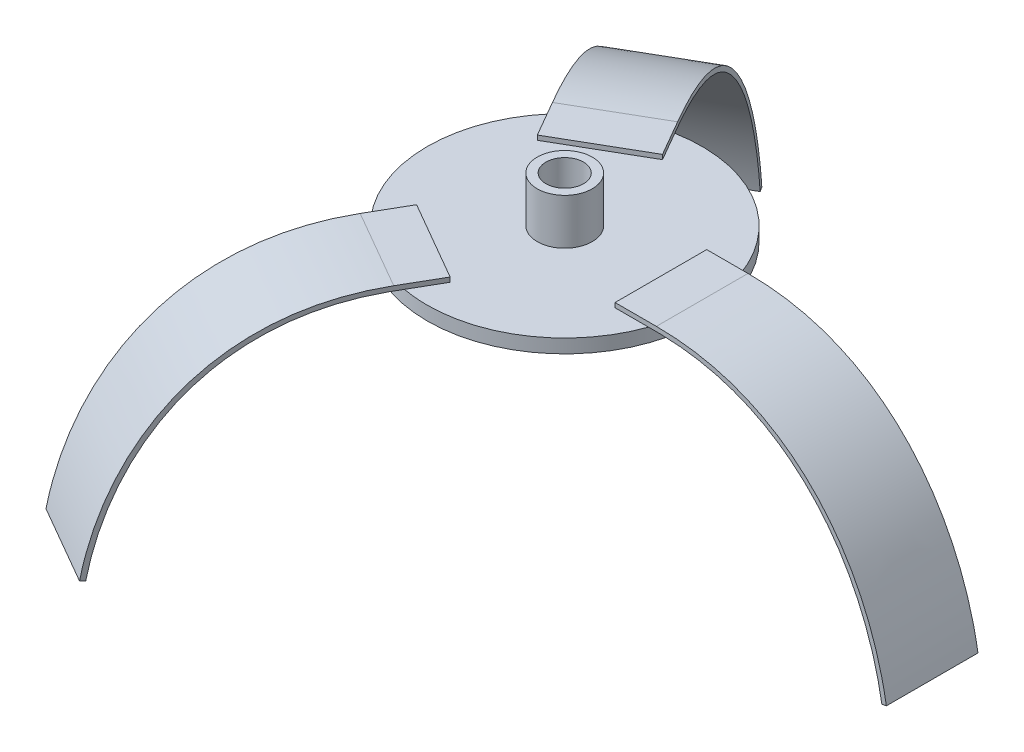
ISO-10303-21;
HEADER;
FILE_DESCRIPTION(('STEP AP214'),'2;1');
FILE_NAME('part.step','',(''),(''),'','','');
FILE_SCHEMA(('AUTOMOTIVE_DESIGN { 1 0 10303 214 1 1 1 1 }'));
ENDSEC;
DATA;
#1=APPLICATION_CONTEXT('core data for automotive mechanical design processes');
#2=APPLICATION_PROTOCOL_DEFINITION('international standard','automotive_design',2000,#1);
#3=PRODUCT_CONTEXT('',#1,'mechanical');
#4=PRODUCT('Part','Part','',(#3));
#5=PRODUCT_RELATED_PRODUCT_CATEGORY('part','',(#4));
#6=PRODUCT_DEFINITION_FORMATION('','',#4);
#7=PRODUCT_DEFINITION_CONTEXT('part definition',#1,'design');
#8=PRODUCT_DEFINITION('design','',#6,#7);
#9=PRODUCT_DEFINITION_SHAPE('','',#8);
#10=(LENGTH_UNIT() NAMED_UNIT(*) SI_UNIT(.MILLI.,.METRE.));
#11=(NAMED_UNIT(*) PLANE_ANGLE_UNIT() SI_UNIT($,.RADIAN.));
#12=(NAMED_UNIT(*) SI_UNIT($,.STERADIAN.) SOLID_ANGLE_UNIT());
#13=UNCERTAINTY_MEASURE_WITH_UNIT(LENGTH_MEASURE(1.E-05),#10,'distance_accuracy_value','');
#14=(GEOMETRIC_REPRESENTATION_CONTEXT(3) GLOBAL_UNCERTAINTY_ASSIGNED_CONTEXT((#13)) GLOBAL_UNIT_ASSIGNED_CONTEXT((#10,
#11,#12)) REPRESENTATION_CONTEXT('',''));
#15=CARTESIAN_POINT('',(0.,0.,0.));
#16=DIRECTION('',(0.,0.,1.));
#17=DIRECTION('',(1.,0.,0.));
#18=AXIS2_PLACEMENT_3D('',#15,#16,#17);
#19=CARTESIAN_POINT('',(0.,-3.,0.));
#20=DIRECTION('',(0.,1.,0.));
#21=DIRECTION('',(0.,0.,1.));
#22=AXIS2_PLACEMENT_3D('',#19,#20,#21);
#23=CYLINDRICAL_SURFACE('',#22,30.);
#24=CARTESIAN_POINT('',(0.,-3.,0.));
#25=DIRECTION('',(0.,1.,0.));
#26=DIRECTION('',(0.,0.,1.));
#27=AXIS2_PLACEMENT_3D('',#24,#25,#26);
#28=CIRCLE('',#27,30.);
#29=CARTESIAN_POINT('',(0.,-3.,30.));
#30=VERTEX_POINT('',#29);
#31=EDGE_CURVE('E417',#30,#30,#28,.T.);
#32=ORIENTED_EDGE('',*,*,#31,.T.);
#33=EDGE_LOOP('',(#32));
#34=FACE_BOUND('',#33,.T.);
#35=CARTESIAN_POINT('',(0.,0.,0.));
#36=DIRECTION('',(0.,1.,0.));
#37=DIRECTION('',(0.,0.,1.));
#38=AXIS2_PLACEMENT_3D('',#35,#36,#37);
#39=CIRCLE('',#38,30.);
#40=CARTESIAN_POINT('',(-22.8023896615752,0.,-19.494897427832));
#41=VERTEX_POINT('',#40);
#42=CARTESIAN_POINT('',(-22.8023896615754,0.,19.4948974278317));
#43=VERTEX_POINT('',#42);
#44=EDGE_CURVE('E438',#41,#43,#39,.T.);
#45=ORIENTED_EDGE('',*,*,#44,.F.);
#46=DIRECTION('',(0.,1.,0.));
#47=VECTOR('',#46,1.);
#48=CARTESIAN_POINT('',(-22.8023896615752,-3.,-19.494897427832));
#49=LINE('',#48,#47);
#50=CARTESIAN_POINT('',(-22.8023896615752,-0.00629805614795278,-19.494897427832));
#51=VERTEX_POINT('',#50);
#52=EDGE_CURVE('E48',#41,#51,#49,.F.);
#53=ORIENTED_EDGE('',*,*,#52,.T.);
#54=CARTESIAN_POINT('',(0.,0.0181105178194184,0.));
#55=DIRECTION('',(-0.000431486543616557,0.999999627638656,-0.000747356616326177));
#56=DIRECTION('',(0.49999981381932,0.000862973087233128,0.86602508131006));
#57=AXIS2_PLACEMENT_3D('',#54,#55,#56);
#58=ELLIPSE('',#57,30.0000111708445,30.);
#59=CARTESIAN_POINT('',(-5.48188158588629,-0.00629805614795273,-29.4948974278318));
#60=VERTEX_POINT('',#59);
#61=EDGE_CURVE('E52',#51,#60,#58,.F.);
#62=ORIENTED_EDGE('',*,*,#61,.T.);
#63=DIRECTION('',(0.,1.,0.));
#64=VECTOR('',#63,1.);
#65=CARTESIAN_POINT('',(-5.48188158588629,-3.,-29.4948974278318));
#66=LINE('',#65,#64);
#67=CARTESIAN_POINT('',(-5.48188158588629,0.,-29.4948974278318));
#68=VERTEX_POINT('',#67);
#69=EDGE_CURVE('E433',#68,#60,#66,.F.);
#70=ORIENTED_EDGE('',*,*,#69,.F.);
#71=CARTESIAN_POINT('',(28.2842712474619,0.,-10.));
#72=VERTEX_POINT('',#71);
#73=EDGE_CURVE('E423',#72,#68,#39,.T.);
#74=ORIENTED_EDGE('',*,*,#73,.F.);
#75=DIRECTION('',(0.,1.,0.));
#76=VECTOR('',#75,1.);
#77=CARTESIAN_POINT('',(28.2842712474619,-3.,-10.));
#78=LINE('',#77,#76);
#79=CARTESIAN_POINT('',(28.2842712474619,-0.00629805614795278,-10.));
#80=VERTEX_POINT('',#79);
#81=EDGE_CURVE('E537',#72,#80,#78,.F.);
#82=ORIENTED_EDGE('',*,*,#81,.T.);
#83=CARTESIAN_POINT('',(0.,0.0181105178194184,0.));
#84=DIRECTION('',(0.000862973087233128,0.999999627638656,0.));
#85=DIRECTION('',(-0.999999627638656,0.000862973087233128,0.));
#86=AXIS2_PLACEMENT_3D('',#83,#84,#85);
#87=ELLIPSE('',#86,30.0000111708445,30.);
#88=CARTESIAN_POINT('',(28.2842712474619,-0.00629805614795273,10.));
#89=VERTEX_POINT('',#88);
#90=EDGE_CURVE('E539',#80,#89,#87,.F.);
#91=ORIENTED_EDGE('',*,*,#90,.T.);
#92=DIRECTION('',(0.,1.,0.));
#93=VECTOR('',#92,1.);
#94=CARTESIAN_POINT('',(28.2842712474619,-3.,10.));
#95=LINE('',#94,#93);
#96=CARTESIAN_POINT('',(28.2842712474619,0.,10.));
#97=VERTEX_POINT('',#96);
#98=EDGE_CURVE('E534',#97,#89,#95,.F.);
#99=ORIENTED_EDGE('',*,*,#98,.F.);
#100=CARTESIAN_POINT('',(-5.4818815858867,0.,29.4948974278318));
#101=VERTEX_POINT('',#100);
#102=EDGE_CURVE('E439',#101,#97,#39,.T.);
#103=ORIENTED_EDGE('',*,*,#102,.F.);
#104=DIRECTION('',(0.,1.,0.));
#105=VECTOR('',#104,1.);
#106=CARTESIAN_POINT('',(-5.4818815858867,-3.,29.4948974278318));
#107=LINE('',#106,#105);
#108=CARTESIAN_POINT('',(-5.48188158588669,-0.00629805614795277,29.4948974278318));
#109=VERTEX_POINT('',#108);
#110=EDGE_CURVE('E314',#101,#109,#107,.F.);
#111=ORIENTED_EDGE('',*,*,#110,.T.);
#112=CARTESIAN_POINT('',(0.,0.018110517819418,0.));
#113=DIRECTION('',(-0.000431486543616567,0.999999627638656,0.000747356616326171));
#114=DIRECTION('',(0.499999813819332,0.000862973087233128,-0.866025081310053));
#115=AXIS2_PLACEMENT_3D('',#112,#113,#114);
#116=ELLIPSE('',#115,30.0000111708445,30.);
#117=CARTESIAN_POINT('',(-22.8023896615754,-0.00629805614795273,19.4948974278317));
#118=VERTEX_POINT('',#117);
#119=EDGE_CURVE('E316',#109,#118,#116,.F.);
#120=ORIENTED_EDGE('',*,*,#119,.T.);
#121=DIRECTION('',(0.,1.,0.));
#122=VECTOR('',#121,1.);
#123=CARTESIAN_POINT('',(-22.8023896615754,-3.,19.4948974278317));
#124=LINE('',#123,#122);
#125=EDGE_CURVE('E311',#43,#118,#124,.F.);
#126=ORIENTED_EDGE('',*,*,#125,.F.);
#127=EDGE_LOOP('',(#45,#53,#62,#70,#74,#82,#91,#99,#103,#111,#120,#126));
#128=FACE_BOUND('',#127,.T.);
#129=ADVANCED_FACE('F34',(#34,#128),#23,.T.);
#130=CARTESIAN_POINT('',(0.,0.,0.));
#131=DIRECTION('',(0.,1.,0.));
#132=DIRECTION('',(0.,0.,1.));
#133=AXIS2_PLACEMENT_3D('',#130,#131,#132);
#134=PLANE('',#133);
#135=CARTESIAN_POINT('',(0.,0.,0.));
#136=DIRECTION('',(0.,1.,0.));
#137=DIRECTION('',(0.,0.,1.));
#138=AXIS2_PLACEMENT_3D('',#135,#136,#137);
#139=CIRCLE('',#138,6.);
#140=CARTESIAN_POINT('',(0.,0.,6.));
#141=VERTEX_POINT('',#140);
#142=EDGE_CURVE('E541',#141,#141,#139,.T.);
#143=ORIENTED_EDGE('',*,*,#142,.F.);
#144=EDGE_LOOP('',(#143));
#145=FACE_BOUND('',#144,.T.);
#146=DIRECTION('',(0.866025403784443,0.,-0.499999999999992));
#147=VECTOR('',#146,1.);
#148=CARTESIAN_POINT('',(-19.1533455048258,0.,-13.1745675492796));
#149=LINE('',#148,#147);
#150=CARTESIAN_POINT('',(-19.1533455048258,0.,-13.1745675492796));
#151=VERTEX_POINT('',#150);
#152=CARTESIAN_POINT('',(-1.83283742913692,0.,-23.1745675492794));
#153=VERTEX_POINT('',#152);
#154=EDGE_CURVE('E203',#151,#153,#149,.T.);
#155=ORIENTED_EDGE('',*,*,#154,.F.);
#156=DIRECTION('',(-0.499999999999992,0.,-0.866025403784443));
#157=VECTOR('',#156,1.);
#158=CARTESIAN_POINT('',(-8.66025403784444,0.,4.99999999999992));
#159=LINE('',#158,#157);
#160=EDGE_CURVE('E11',#151,#41,#159,.T.);
#161=ORIENTED_EDGE('',*,*,#160,.T.);
#162=ORIENTED_EDGE('',*,*,#44,.T.);
#163=DIRECTION('',(-0.500000000000004,0.,0.866025403784436));
#164=VECTOR('',#163,1.);
#165=CARTESIAN_POINT('',(-8.66025403784436,0.,-5.00000000000004));
#166=LINE('',#165,#164);
#167=CARTESIAN_POINT('',(-19.153345504826,0.,13.1745675492794));
#168=VERTEX_POINT('',#167);
#169=EDGE_CURVE('E428',#168,#43,#166,.T.);
#170=ORIENTED_EDGE('',*,*,#169,.F.);
#171=DIRECTION('',(-0.866025403784436,0.,-0.500000000000004));
#172=VECTOR('',#171,1.);
#173=CARTESIAN_POINT('',(-1.83283742913724,0.,23.1745675492794));
#174=LINE('',#173,#172);
#175=CARTESIAN_POINT('',(-1.83283742913724,0.,23.1745675492794));
#176=VERTEX_POINT('',#175);
#177=EDGE_CURVE('E308',#176,#168,#174,.T.);
#178=ORIENTED_EDGE('',*,*,#177,.F.);
#179=DIRECTION('',(-0.500000000000004,0.,0.866025403784436));
#180=VECTOR('',#179,1.);
#181=CARTESIAN_POINT('',(8.66025403784436,0.,5.00000000000004));
#182=LINE('',#181,#180);
#183=EDGE_CURVE('E431',#176,#101,#182,.T.);
#184=ORIENTED_EDGE('',*,*,#183,.T.);
#185=ORIENTED_EDGE('',*,*,#102,.T.);
#186=DIRECTION('',(1.,0.,0.));
#187=VECTOR('',#186,1.);
#188=CARTESIAN_POINT('',(0.,0.,10.));
#189=LINE('',#188,#187);
#190=CARTESIAN_POINT('',(20.986182933963,0.,10.));
#191=VERTEX_POINT('',#190);
#192=EDGE_CURVE('E416',#191,#97,#189,.T.);
#193=ORIENTED_EDGE('',*,*,#192,.F.);
#194=DIRECTION('',(0.,0.,1.));
#195=VECTOR('',#194,1.);
#196=CARTESIAN_POINT('',(20.986182933963,0.,-10.));
#197=LINE('',#196,#195);
#198=CARTESIAN_POINT('',(20.986182933963,0.,-10.));
#199=VERTEX_POINT('',#198);
#200=EDGE_CURVE('E531',#199,#191,#197,.T.);
#201=ORIENTED_EDGE('',*,*,#200,.F.);
#202=DIRECTION('',(1.,0.,0.));
#203=VECTOR('',#202,1.);
#204=CARTESIAN_POINT('',(0.,0.,-10.));
#205=LINE('',#204,#203);
#206=EDGE_CURVE('E420',#199,#72,#205,.T.);
#207=ORIENTED_EDGE('',*,*,#206,.T.);
#208=ORIENTED_EDGE('',*,*,#73,.T.);
#209=DIRECTION('',(-0.499999999999992,0.,-0.866025403784443));
#210=VECTOR('',#209,1.);
#211=CARTESIAN_POINT('',(8.66025403784443,0.,-4.99999999999992));
#212=LINE('',#211,#210);
#213=EDGE_CURVE('E41',#153,#68,#212,.T.);
#214=ORIENTED_EDGE('',*,*,#213,.F.);
#215=EDGE_LOOP('',(#155,#161,#162,#170,#178,#184,#185,#193,#201,#207,#208,#214));
#216=FACE_BOUND('',#215,.T.);
#217=ADVANCED_FACE('F398',(#145,#216),#134,.T.);
#218=CARTESIAN_POINT('',(0.,-3.,0.));
#219=DIRECTION('',(0.,1.,0.));
#220=DIRECTION('',(0.,0.,1.));
#221=AXIS2_PLACEMENT_3D('',#218,#219,#220);
#222=PLANE('',#221);
#223=ORIENTED_EDGE('',*,*,#31,.F.);
#224=EDGE_LOOP('',(#223));
#225=FACE_BOUND('',#224,.T.);
#226=ADVANCED_FACE('F395',(#225),#222,.F.);
#227=CARTESIAN_POINT('',(0.,10.,0.));
#228=DIRECTION('',(0.,-1.,0.));
#229=DIRECTION('',(0.,0.,-1.));
#230=AXIS2_PLACEMENT_3D('',#227,#228,#229);
#231=CYLINDRICAL_SURFACE('',#230,4.1);
#232=CARTESIAN_POINT('',(0.,10.,0.));
#233=DIRECTION('',(0.,1.,0.));
#234=DIRECTION('',(0.,0.,1.));
#235=AXIS2_PLACEMENT_3D('',#232,#233,#234);
#236=CIRCLE('',#235,4.1);
#237=CARTESIAN_POINT('',(0.,10.,4.1));
#238=VERTEX_POINT('',#237);
#239=EDGE_CURVE('E542',#238,#238,#236,.T.);
#240=ORIENTED_EDGE('',*,*,#239,.T.);
#241=EDGE_LOOP('',(#240));
#242=FACE_BOUND('',#241,.T.);
#243=CARTESIAN_POINT('',(0.,0.,0.));
#244=DIRECTION('',(0.,1.,0.));
#245=DIRECTION('',(0.,0.,1.));
#246=AXIS2_PLACEMENT_3D('',#243,#244,#245);
#247=CIRCLE('',#246,4.1);
#248=CARTESIAN_POINT('',(0.,0.,4.1));
#249=VERTEX_POINT('',#248);
#250=EDGE_CURVE('E414',#249,#249,#247,.F.);
#251=ORIENTED_EDGE('',*,*,#250,.T.);
#252=EDGE_LOOP('',(#251));
#253=FACE_BOUND('',#252,.T.);
#254=ADVANCED_FACE('F391',(#242,#253),#231,.F.);
#255=CARTESIAN_POINT('',(0.,10.,0.));
#256=DIRECTION('',(0.,-1.,0.));
#257=DIRECTION('',(0.,0.,-1.));
#258=AXIS2_PLACEMENT_3D('',#255,#256,#257);
#259=CYLINDRICAL_SURFACE('',#258,6.);
#260=CARTESIAN_POINT('',(0.,10.,0.));
#261=DIRECTION('',(0.,1.,0.));
#262=DIRECTION('',(0.,0.,1.));
#263=AXIS2_PLACEMENT_3D('',#260,#261,#262);
#264=CIRCLE('',#263,6.);
#265=CARTESIAN_POINT('',(0.,10.,6.));
#266=VERTEX_POINT('',#265);
#267=EDGE_CURVE('E545',#266,#266,#264,.T.);
#268=ORIENTED_EDGE('',*,*,#267,.F.);
#269=EDGE_LOOP('',(#268));
#270=FACE_BOUND('',#269,.T.);
#271=ORIENTED_EDGE('',*,*,#142,.T.);
#272=EDGE_LOOP('',(#271));
#273=FACE_BOUND('',#272,.T.);
#274=ADVANCED_FACE('F387',(#270,#273),#259,.T.);
#275=CARTESIAN_POINT('',(0.,10.,0.));
#276=DIRECTION('',(0.,1.,0.));
#277=DIRECTION('',(0.,0.,1.));
#278=AXIS2_PLACEMENT_3D('',#275,#276,#277);
#279=PLANE('',#278);
#280=ORIENTED_EDGE('',*,*,#239,.F.);
#281=EDGE_LOOP('',(#280));
#282=FACE_BOUND('',#281,.T.);
#283=ORIENTED_EDGE('',*,*,#267,.T.);
#284=EDGE_LOOP('',(#283));
#285=FACE_BOUND('',#284,.T.);
#286=ADVANCED_FACE('F384',(#282,#285),#279,.T.);
#287=ORIENTED_EDGE('',*,*,#250,.F.);
#288=EDGE_LOOP('',(#287));
#289=FACE_BOUND('',#288,.T.);
#290=ADVANCED_FACE('F382',(#289),#134,.T.);
#291=CARTESIAN_POINT('',(30.9999626604561,-0.00864162562325154,-10.));
#292=DIRECTION('',(0.000862973087233128,0.999999627638656,0.));
#293=DIRECTION('',(-0.999999627638656,0.000862973087233128,0.));
#294=AXIS2_PLACEMENT_3D('',#291,#292,#293);
#295=PLANE('',#294);
#296=ORIENTED_EDGE('',*,*,#90,.F.);
#297=DIRECTION('',(-0.999999627638656,0.000862973087233128,0.));
#298=VECTOR('',#297,1.);
#299=CARTESIAN_POINT('',(30.9999626604561,-0.00864162562325154,-10.));
#300=LINE('',#299,#298);
#301=CARTESIAN_POINT('',(30.9999626604561,-0.00864162562325154,-10.));
#302=VERTEX_POINT('',#301);
#303=EDGE_CURVE('E343',#302,#80,#300,.T.);
#304=ORIENTED_EDGE('',*,*,#303,.F.);
#305=DIRECTION('',(0.,0.,1.));
#306=VECTOR('',#305,1.);
#307=CARTESIAN_POINT('',(30.9999626604561,-0.00864162562325154,-10.));
#308=LINE('',#307,#306);
#309=CARTESIAN_POINT('',(30.9999626604561,-0.00864162562325154,10.));
#310=VERTEX_POINT('',#309);
#311=EDGE_CURVE('E518',#302,#310,#308,.T.);
#312=ORIENTED_EDGE('',*,*,#311,.T.);
#313=DIRECTION('',(-0.999999627638656,0.000862973087233128,0.));
#314=VECTOR('',#313,1.);
#315=CARTESIAN_POINT('',(30.9999626604561,-0.00864162562325154,10.));
#316=LINE('',#315,#314);
#317=EDGE_CURVE('E318',#310,#89,#316,.T.);
#318=ORIENTED_EDGE('',*,*,#317,.T.);
#319=EDGE_LOOP('',(#296,#304,#312,#318));
#320=FACE_BOUND('',#319,.T.);
#321=ADVANCED_FACE('F378',(#320),#295,.F.);
#322=CARTESIAN_POINT('',(20.986182933963,0.,-10.));
#323=DIRECTION('',(1.,0.,0.));
#324=DIRECTION('',(0.,0.,-1.));
#325=AXIS2_PLACEMENT_3D('',#322,#323,#324);
#326=PLANE('',#325);
#327=ORIENTED_EDGE('',*,*,#200,.T.);
#328=DIRECTION('',(0.,1.,0.));
#329=VECTOR('',#328,1.);
#330=CARTESIAN_POINT('',(20.986182933963,0.,10.));
#331=LINE('',#330,#329);
#332=CARTESIAN_POINT('',(20.986182933963,1.,10.));
#333=VERTEX_POINT('',#332);
#334=EDGE_CURVE('E321',#191,#333,#331,.T.);
#335=ORIENTED_EDGE('',*,*,#334,.T.);
#336=DIRECTION('',(0.,0.,1.));
#337=VECTOR('',#336,1.);
#338=CARTESIAN_POINT('',(20.986182933963,1.,-10.));
#339=LINE('',#338,#337);
#340=CARTESIAN_POINT('',(20.986182933963,1.,-10.));
#341=VERTEX_POINT('',#340);
#342=EDGE_CURVE('E529',#341,#333,#339,.T.);
#343=ORIENTED_EDGE('',*,*,#342,.F.);
#344=DIRECTION('',(0.,1.,0.));
#345=VECTOR('',#344,1.);
#346=CARTESIAN_POINT('',(20.986182933963,0.,-10.));
#347=LINE('',#346,#345);
#348=EDGE_CURVE('E349',#199,#341,#347,.T.);
#349=ORIENTED_EDGE('',*,*,#348,.F.);
#350=EDGE_LOOP('',(#327,#335,#343,#349));
#351=FACE_BOUND('',#350,.T.);
#352=ADVANCED_FACE('F374',(#351),#326,.F.);
#353=CARTESIAN_POINT('',(20.986182933963,1.,-10.));
#354=DIRECTION('',(0.,-1.,0.));
#355=DIRECTION('',(0.,0.,-1.));
#356=AXIS2_PLACEMENT_3D('',#353,#354,#355);
#357=PLANE('',#356);
#358=ORIENTED_EDGE('',*,*,#342,.T.);
#359=DIRECTION('',(1.,0.,0.));
#360=VECTOR('',#359,1.);
#361=CARTESIAN_POINT('',(20.986182933963,1.,10.));
#362=LINE('',#361,#360);
#363=CARTESIAN_POINT('',(30.,1.,10.));
#364=VERTEX_POINT('',#363);
#365=EDGE_CURVE('E324',#333,#364,#362,.T.);
#366=ORIENTED_EDGE('',*,*,#365,.T.);
#367=DIRECTION('',(0.,0.,1.));
#368=VECTOR('',#367,1.);
#369=CARTESIAN_POINT('',(30.,1.,-10.));
#370=LINE('',#369,#368);
#371=CARTESIAN_POINT('',(30.,1.,-10.));
#372=VERTEX_POINT('',#371);
#373=EDGE_CURVE('E527',#372,#364,#370,.T.);
#374=ORIENTED_EDGE('',*,*,#373,.F.);
#375=DIRECTION('',(1.,0.,0.));
#376=VECTOR('',#375,1.);
#377=CARTESIAN_POINT('',(20.986182933963,1.,-10.));
#378=LINE('',#377,#376);
#379=EDGE_CURVE('E351',#341,#372,#378,.T.);
#380=ORIENTED_EDGE('',*,*,#379,.F.);
#381=EDGE_LOOP('',(#358,#366,#374,#380));
#382=FACE_BOUND('',#381,.T.);
#383=ADVANCED_FACE('F369',(#382),#357,.F.);
#384=CARTESIAN_POINT('',(30.,1.,-10.));
#385=CARTESIAN_POINT('',(60.374034605793,1.,-10.));
#386=CARTESIAN_POINT('',(76.3301524508652,-22.3511139151218,-10.));
#387=CARTESIAN_POINT('',(80.1955201744383,-45.6358956346067,-10.));
#388=B_SPLINE_CURVE_WITH_KNOTS('',3,(#384,#385,#386,#387),.UNSPECIFIED.,.F.,.F.,(4,4),(0.,1.),.UNSPECIFIED.);
#389=DIRECTION('',(0.,0.,1.));
#390=VECTOR('',#389,1.);
#391=SURFACE_OF_LINEAR_EXTRUSION('',#388,#390);
#392=ORIENTED_EDGE('',*,*,#373,.T.);
#393=CARTESIAN_POINT('',(30.,1.,10.));
#394=CARTESIAN_POINT('',(60.374034605793,1.,10.));
#395=CARTESIAN_POINT('',(76.3301524508652,-22.3511139151218,10.));
#396=CARTESIAN_POINT('',(80.1955201744383,-45.6358956346067,10.));
#397=B_SPLINE_CURVE_WITH_KNOTS('',3,(#393,#394,#395,#396),.UNSPECIFIED.,.F.,.F.,(4,4),(0.,1.),.UNSPECIFIED.);
#398=CARTESIAN_POINT('',(80.1955201744383,-45.6358956346067,10.));
#399=VERTEX_POINT('',#398);
#400=EDGE_CURVE('E327',#364,#399,#397,.T.);
#401=ORIENTED_EDGE('',*,*,#400,.T.);
#402=DIRECTION('',(0.,0.,1.));
#403=VECTOR('',#402,1.);
#404=CARTESIAN_POINT('',(80.1955201744383,-45.6358956346067,-10.));
#405=LINE('',#404,#403);
#406=CARTESIAN_POINT('',(80.1955201744383,-45.6358956346067,-10.));
#407=VERTEX_POINT('',#406);
#408=EDGE_CURVE('E525',#407,#399,#405,.T.);
#409=ORIENTED_EDGE('',*,*,#408,.F.);
#410=EDGE_CURVE('E353',#372,#407,#388,.T.);
#411=ORIENTED_EDGE('',*,*,#410,.F.);
#412=EDGE_LOOP('',(#392,#401,#409,#411));
#413=FACE_BOUND('',#412,.T.);
#414=ADVANCED_FACE('F364',(#413),#391,.F.);
#415=CARTESIAN_POINT('',(79.2090204525559,-45.7996585691369,-10.));
#416=DIRECTION('',(0.163762934530201,-0.986499721882402,0.));
#417=DIRECTION('',(0.986499721882402,0.163762934530201,0.));
#418=AXIS2_PLACEMENT_3D('',#415,#416,#417);
#419=PLANE('',#418);
#420=ORIENTED_EDGE('',*,*,#408,.T.);
#421=DIRECTION('',(0.986499721882402,0.163762934530201,0.));
#422=VECTOR('',#421,1.);
#423=CARTESIAN_POINT('',(79.2090204525559,-45.7996585691369,10.));
#424=LINE('',#423,#422);
#425=CARTESIAN_POINT('',(79.2090204525559,-45.7996585691369,10.));
#426=VERTEX_POINT('',#425);
#427=EDGE_CURVE('E332',#426,#399,#424,.T.);
#428=ORIENTED_EDGE('',*,*,#427,.F.);
#429=DIRECTION('',(0.,0.,1.));
#430=VECTOR('',#429,1.);
#431=CARTESIAN_POINT('',(79.2090204525559,-45.7996585691369,-10.));
#432=LINE('',#431,#430);
#433=CARTESIAN_POINT('',(79.2090204525559,-45.7996585691369,-10.));
#434=VERTEX_POINT('',#433);
#435=EDGE_CURVE('E523',#434,#426,#432,.T.);
#436=ORIENTED_EDGE('',*,*,#435,.F.);
#437=DIRECTION('',(0.986499721882402,0.163762934530201,0.));
#438=VECTOR('',#437,1.);
#439=CARTESIAN_POINT('',(79.2090204525559,-45.7996585691369,-10.));
#440=LINE('',#439,#438);
#441=EDGE_CURVE('E358',#434,#407,#440,.T.);
#442=ORIENTED_EDGE('',*,*,#441,.T.);
#443=EDGE_LOOP('',(#420,#428,#436,#442));
#444=FACE_BOUND('',#443,.T.);
#445=ADVANCED_FACE('F368',(#444),#419,.T.);
#446=CARTESIAN_POINT('',(30.9999626604561,-0.00864162562325154,-10.));
#447=CARTESIAN_POINT('',(31.8992427151059,-0.0242397859588178,-10.));
#448=CARTESIAN_POINT('',(33.7157297025838,-0.0995428560176276,-10.));
#449=CARTESIAN_POINT('',(37.1900190889868,-0.41682202700455,-10.));
#450=CARTESIAN_POINT('',(41.3436189564676,-1.11706829146497,-10.));
#451=CARTESIAN_POINT('',(45.9977692918907,-2.40892622976559,-10.));
#452=CARTESIAN_POINT('',(51.78318660303,-4.68997272537877,-10.));
#453=CARTESIAN_POINT('',(58.2371350306549,-8.50827688816202,-10.));
#454=CARTESIAN_POINT('',(64.7792885725047,-14.3880680114556,-10.));
#455=CARTESIAN_POINT('',(70.1457700055622,-21.3159941803048,-10.));
#456=CARTESIAN_POINT('',(74.3571674944091,-29.0371942850117,-10.));
#457=CARTESIAN_POINT('',(76.9192173916988,-35.9102513515241,-10.));
#458=CARTESIAN_POINT('',(78.41206479806,-41.5467624501891,-10.));
#459=CARTESIAN_POINT('',(78.9724729066837,-44.3747079911301,-10.));
#460=CARTESIAN_POINT('',(79.2090204525559,-45.7996585691369,-10.));
#461=B_SPLINE_CURVE_WITH_KNOTS('',3,(#446,#447,#448,#449,#450,#451,#452,#453,#454,#455,#456,
#457,#458,#459,#460),.UNSPECIFIED.,.F.,.F.,(4,1,1,1,1,1,1,1,1,1,1,1,4),(0.011223960743554,
0.0421232119703179,0.0730224631970818,0.13482096565061,0.196619468104138,0.258417970557665,
0.382014975464721,0.505611980371777,0.629208985278833,0.752805990185889,0.876402995092944,
0.938201497546472,1.),.UNSPECIFIED.);
#462=DIRECTION('',(0.,0.,1.));
#463=VECTOR('',#462,1.);
#464=SURFACE_OF_LINEAR_EXTRUSION('',#461,#463);
#465=ORIENTED_EDGE('',*,*,#435,.T.);
#466=CARTESIAN_POINT('',(30.9999626604561,-0.00864162562325154,10.));
#467=CARTESIAN_POINT('',(31.8992427151059,-0.0242397859588178,10.));
#468=CARTESIAN_POINT('',(33.7157297025838,-0.0995428560176276,10.));
#469=CARTESIAN_POINT('',(37.1900190889868,-0.41682202700455,10.));
#470=CARTESIAN_POINT('',(41.3436189564676,-1.11706829146497,10.));
#471=CARTESIAN_POINT('',(45.9977692918907,-2.40892622976559,10.));
#472=CARTESIAN_POINT('',(51.78318660303,-4.68997272537877,10.));
#473=CARTESIAN_POINT('',(58.2371350306549,-8.50827688816202,10.));
#474=CARTESIAN_POINT('',(64.7792885725047,-14.3880680114556,10.));
#475=CARTESIAN_POINT('',(70.1457700055622,-21.3159941803048,10.));
#476=CARTESIAN_POINT('',(74.3571674944091,-29.0371942850117,10.));
#477=CARTESIAN_POINT('',(76.9192173916988,-35.9102513515241,10.));
#478=CARTESIAN_POINT('',(78.41206479806,-41.5467624501891,10.));
#479=CARTESIAN_POINT('',(78.9724729066837,-44.3747079911301,10.));
#480=CARTESIAN_POINT('',(79.2090204525559,-45.7996585691369,10.));
#481=B_SPLINE_CURVE_WITH_KNOTS('',3,(#466,#467,#468,#469,#470,#471,#472,#473,#474,#475,#476,
#477,#478,#479,#480),.UNSPECIFIED.,.F.,.F.,(4,1,1,1,1,1,1,1,1,1,1,1,4),(0.011223960743554,
0.0421232119703179,0.0730224631970818,0.13482096565061,0.196619468104138,0.258417970557665,
0.382014975464721,0.505611980371777,0.629208985278833,0.752805990185889,0.876402995092944,
0.938201497546472,1.),.UNSPECIFIED.);
#482=EDGE_CURVE('E338',#310,#426,#481,.T.);
#483=ORIENTED_EDGE('',*,*,#482,.F.);
#484=ORIENTED_EDGE('',*,*,#311,.F.);
#485=EDGE_CURVE('E512',#302,#434,#461,.T.);
#486=ORIENTED_EDGE('',*,*,#485,.T.);
#487=EDGE_LOOP('',(#465,#483,#484,#486));
#488=FACE_BOUND('',#487,.T.);
#489=ADVANCED_FACE('F508',(#488),#464,.T.);
#490=CARTESIAN_POINT('',(65.0385101680516,-13.5861546724965,-10.));
#491=DIRECTION('',(0.,0.,1.));
#492=DIRECTION('',(1.,0.,0.));
#493=AXIS2_PLACEMENT_3D('',#490,#491,#492);
#494=PLANE('',#493);
#495=ORIENTED_EDGE('',*,*,#81,.F.);
#496=ORIENTED_EDGE('',*,*,#206,.F.);
#497=ORIENTED_EDGE('',*,*,#348,.T.);
#498=ORIENTED_EDGE('',*,*,#379,.T.);
#499=ORIENTED_EDGE('',*,*,#410,.T.);
#500=ORIENTED_EDGE('',*,*,#441,.F.);
#501=ORIENTED_EDGE('',*,*,#485,.F.);
#502=ORIENTED_EDGE('',*,*,#303,.T.);
#503=EDGE_LOOP('',(#495,#496,#497,#498,#499,#500,#501,#502));
#504=FACE_BOUND('',#503,.T.);
#505=ADVANCED_FACE('F505',(#504),#494,.F.);
#506=CARTESIAN_POINT('',(65.0385101680516,-13.5861546724965,10.));
#507=DIRECTION('',(0.,0.,1.));
#508=DIRECTION('',(1.,0.,0.));
#509=AXIS2_PLACEMENT_3D('',#506,#507,#508);
#510=PLANE('',#509);
#511=ORIENTED_EDGE('',*,*,#192,.T.);
#512=ORIENTED_EDGE('',*,*,#98,.T.);
#513=ORIENTED_EDGE('',*,*,#317,.F.);
#514=ORIENTED_EDGE('',*,*,#482,.T.);
#515=ORIENTED_EDGE('',*,*,#427,.T.);
#516=ORIENTED_EDGE('',*,*,#400,.F.);
#517=ORIENTED_EDGE('',*,*,#365,.F.);
#518=ORIENTED_EDGE('',*,*,#334,.F.);
#519=EDGE_LOOP('',(#511,#512,#513,#514,#515,#516,#517,#518));
#520=FACE_BOUND('',#519,.T.);
#521=ADVANCED_FACE('F501',(#520),#510,.T.);
#522=CARTESIAN_POINT('',(-6.8397272923838,-0.00864162562325154,31.846755180324));
#523=DIRECTION('',(-0.000431486543616567,0.999999627638656,0.000747356616326171));
#524=DIRECTION('',(0.,-0.000747356685897847,0.999999720728953));
#525=AXIS2_PLACEMENT_3D('',#522,#523,#524);
#526=PLANE('',#525);
#527=ORIENTED_EDGE('',*,*,#119,.F.);
#528=DIRECTION('',(0.499999813819332,0.000862973087233128,-0.866025081310053));
#529=VECTOR('',#528,1.);
#530=CARTESIAN_POINT('',(-6.8397272923838,-0.00864162562325154,31.846755180324));
#531=LINE('',#530,#529);
#532=CARTESIAN_POINT('',(-6.8397272923838,-0.00864162562325154,31.846755180324));
#533=VERTEX_POINT('',#532);
#534=EDGE_CURVE('E470',#533,#109,#531,.T.);
#535=ORIENTED_EDGE('',*,*,#534,.F.);
#536=DIRECTION('',(-0.866025403784436,0.,-0.500000000000004));
#537=VECTOR('',#536,1.);
#538=CARTESIAN_POINT('',(-6.8397272923838,-0.00864162562325154,31.846755180324));
#539=LINE('',#538,#537);
#540=CARTESIAN_POINT('',(-24.1602353680725,-0.00864162562325154,21.8467551803239));
#541=VERTEX_POINT('',#540);
#542=EDGE_CURVE('E293',#533,#541,#539,.T.);
#543=ORIENTED_EDGE('',*,*,#542,.T.);
#544=DIRECTION('',(0.499999813819332,0.000862973087233128,-0.866025081310053));
#545=VECTOR('',#544,1.);
#546=CARTESIAN_POINT('',(-24.1602353680725,-0.00864162562325154,21.8467551803239));
#547=LINE('',#546,#545);
#548=EDGE_CURVE('E445',#541,#118,#547,.T.);
#549=ORIENTED_EDGE('',*,*,#548,.T.);
#550=EDGE_LOOP('',(#527,#535,#543,#549));
#551=FACE_BOUND('',#550,.T.);
#552=ADVANCED_FACE('F497',(#551),#526,.F.);
#553=CARTESIAN_POINT('',(-1.83283742913724,0.,23.1745675492794));
#554=DIRECTION('',(-0.500000000000004,0.,0.866025403784436));
#555=DIRECTION('',(0.866025403784436,0.,0.500000000000004));
#556=AXIS2_PLACEMENT_3D('',#553,#554,#555);
#557=PLANE('',#556);
#558=ORIENTED_EDGE('',*,*,#177,.T.);
#559=DIRECTION('',(0.,1.,0.));
#560=VECTOR('',#559,1.);
#561=CARTESIAN_POINT('',(-19.153345504826,0.,13.1745675492793));
#562=LINE('',#561,#560);
#563=CARTESIAN_POINT('',(-19.153345504826,1.,13.1745675492793));
#564=VERTEX_POINT('',#563);
#565=EDGE_CURVE('E448',#168,#564,#562,.T.);
#566=ORIENTED_EDGE('',*,*,#565,.T.);
#567=DIRECTION('',(-0.866025403784436,0.,-0.500000000000004));
#568=VECTOR('',#567,1.);
#569=CARTESIAN_POINT('',(-1.83283742913724,1.,23.1745675492794));
#570=LINE('',#569,#568);
#571=CARTESIAN_POINT('',(-1.83283742913724,1.,23.1745675492794));
#572=VERTEX_POINT('',#571);
#573=EDGE_CURVE('E306',#572,#564,#570,.T.);
#574=ORIENTED_EDGE('',*,*,#573,.F.);
#575=DIRECTION('',(0.,1.,0.));
#576=VECTOR('',#575,1.);
#577=CARTESIAN_POINT('',(-1.83283742913724,0.,23.1745675492794));
#578=LINE('',#577,#576);
#579=EDGE_CURVE('E476',#176,#572,#578,.T.);
#580=ORIENTED_EDGE('',*,*,#579,.F.);
#581=EDGE_LOOP('',(#558,#566,#574,#580));
#582=FACE_BOUND('',#581,.T.);
#583=ADVANCED_FACE('F493',(#582),#557,.F.);
#584=CARTESIAN_POINT('',(-1.83283742913724,1.,23.1745675492794));
#585=DIRECTION('',(0.,-1.,0.));
#586=DIRECTION('',(0.,0.,-1.));
#587=AXIS2_PLACEMENT_3D('',#584,#585,#586);
#588=PLANE('',#587);
#589=ORIENTED_EDGE('',*,*,#573,.T.);
#590=DIRECTION('',(-0.500000000000004,0.,0.866025403784436));
#591=VECTOR('',#590,1.);
#592=CARTESIAN_POINT('',(-19.153345504826,1.,13.1745675492793));
#593=LINE('',#592,#591);
#594=CARTESIAN_POINT('',(-23.6602540378445,1.,20.9807621135331));
#595=VERTEX_POINT('',#594);
#596=EDGE_CURVE('E451',#564,#595,#593,.T.);
#597=ORIENTED_EDGE('',*,*,#596,.T.);
#598=DIRECTION('',(-0.866025403784436,0.,-0.500000000000004));
#599=VECTOR('',#598,1.);
#600=CARTESIAN_POINT('',(-6.33974596215576,1.,30.9807621135331));
#601=LINE('',#600,#599);
#602=CARTESIAN_POINT('',(-6.33974596215576,1.,30.9807621135331));
#603=VERTEX_POINT('',#602);
#604=EDGE_CURVE('E304',#603,#595,#601,.T.);
#605=ORIENTED_EDGE('',*,*,#604,.F.);
#606=DIRECTION('',(-0.500000000000004,0.,0.866025403784436));
#607=VECTOR('',#606,1.);
#608=CARTESIAN_POINT('',(-1.83283742913724,1.,23.1745675492794));
#609=LINE('',#608,#607);
#610=EDGE_CURVE('E478',#572,#603,#609,.T.);
#611=ORIENTED_EDGE('',*,*,#610,.F.);
#612=EDGE_LOOP('',(#589,#597,#605,#611));
#613=FACE_BOUND('',#612,.T.);
#614=ADVANCED_FACE('F489',(#613),#588,.F.);
#615=CARTESIAN_POINT('',(-6.33974596215576,1.,30.9807621135331));
#616=CARTESIAN_POINT('',(-21.5267632650524,1.,57.2854476975775));
#617=CARTESIAN_POINT('',(-29.5048221875885,-22.3511139151218,71.1038510971882));
#618=CARTESIAN_POINT('',(-31.4375060493751,-45.6358956346067,74.4513577407709));
#619=B_SPLINE_CURVE_WITH_KNOTS('',3,(#615,#616,#617,#618),.UNSPECIFIED.,.F.,.F.,(4,4),(0.,1.),.UNSPECIFIED.);
#620=DIRECTION('',(-0.866025403784436,0.,-0.500000000000004));
#621=VECTOR('',#620,1.);
#622=SURFACE_OF_LINEAR_EXTRUSION('',#619,#621);
#623=ORIENTED_EDGE('',*,*,#604,.T.);
#624=CARTESIAN_POINT('',(-23.6602540378445,1.,20.9807621135331));
#625=CARTESIAN_POINT('',(-38.8472713407411,1.,47.2854476975774));
#626=CARTESIAN_POINT('',(-46.8253302632773,-22.3511139151218,61.1038510971881));
#627=CARTESIAN_POINT('',(-48.7580141250638,-45.6358956346067,64.4513577407708));
#628=B_SPLINE_CURVE_WITH_KNOTS('',3,(#624,#625,#626,#627),.UNSPECIFIED.,.F.,.F.,(4,4),(0.,1.),.UNSPECIFIED.);
#629=CARTESIAN_POINT('',(-48.7580141250638,-45.6358956346067,64.4513577407708));
#630=VERTEX_POINT('',#629);
#631=EDGE_CURVE('E454',#595,#630,#628,.T.);
#632=ORIENTED_EDGE('',*,*,#631,.T.);
#633=DIRECTION('',(-0.866025403784436,0.,-0.500000000000004));
#634=VECTOR('',#633,1.);
#635=CARTESIAN_POINT('',(-31.4375060493751,-45.6358956346067,74.4513577407709));
#636=LINE('',#635,#634);
#637=CARTESIAN_POINT('',(-31.4375060493751,-45.6358956346067,74.4513577407709));
#638=VERTEX_POINT('',#637);
#639=EDGE_CURVE('E302',#638,#630,#636,.T.);
#640=ORIENTED_EDGE('',*,*,#639,.F.);
#641=EDGE_CURVE('E479',#603,#638,#619,.T.);
#642=ORIENTED_EDGE('',*,*,#641,.F.);
#643=EDGE_LOOP('',(#623,#632,#640,#642));
#644=FACE_BOUND('',#643,.T.);
#645=ADVANCED_FACE('F486',(#644),#622,.F.);
#646=CARTESIAN_POINT('',(-30.9442561884339,-45.7996585691369,73.5970239207945));
#647=DIRECTION('',(-0.0818814672651011,-0.986499721882402,0.141822861501442));
#648=DIRECTION('',(0.,-0.142300696592447,-0.989823475044568));
#649=AXIS2_PLACEMENT_3D('',#646,#647,#648);
#650=PLANE('',#649);
#651=ORIENTED_EDGE('',*,*,#639,.T.);
#652=DIRECTION('',(-0.493249860941205,0.163762934530201,0.854333819976442));
#653=VECTOR('',#652,1.);
#654=CARTESIAN_POINT('',(-48.2647642641226,-45.7996585691369,63.5970239207944));
#655=LINE('',#654,#653);
#656=CARTESIAN_POINT('',(-48.2647642641226,-45.7996585691369,63.5970239207944));
#657=VERTEX_POINT('',#656);
#658=EDGE_CURVE('E459',#657,#630,#655,.T.);
#659=ORIENTED_EDGE('',*,*,#658,.F.);
#660=DIRECTION('',(-0.866025403784436,0.,-0.500000000000004));
#661=VECTOR('',#660,1.);
#662=CARTESIAN_POINT('',(-30.9442561884339,-45.7996585691369,73.5970239207945));
#663=LINE('',#662,#661);
#664=CARTESIAN_POINT('',(-30.9442561884339,-45.7996585691369,73.5970239207945));
#665=VERTEX_POINT('',#664);
#666=EDGE_CURVE('E300',#665,#657,#663,.T.);
#667=ORIENTED_EDGE('',*,*,#666,.F.);
#668=DIRECTION('',(-0.493249860941205,0.163762934530201,0.854333819976442));
#669=VECTOR('',#668,1.);
#670=CARTESIAN_POINT('',(-30.9442561884339,-45.7996585691369,73.5970239207945));
#671=LINE('',#670,#669);
#672=EDGE_CURVE('E294',#665,#638,#671,.T.);
#673=ORIENTED_EDGE('',*,*,#672,.T.);
#674=EDGE_LOOP('',(#651,#659,#667,#673));
#675=FACE_BOUND('',#674,.T.);
#676=ADVANCED_FACE('F283',(#675),#650,.T.);
#677=CARTESIAN_POINT('',(-6.8397272923838,-0.00864162562325154,31.846755180324));
#678=CARTESIAN_POINT('',(-7.28936731970873,-0.0242397859588178,32.6255545527674));
#679=CARTESIAN_POINT('',(-8.19761081344766,-0.0995428560176276,34.1986784295671));
#680=CARTESIAN_POINT('',(-9.93475550664917,-0.41682202700455,37.2075012982907));
#681=CARTESIAN_POINT('',(-12.0115554403896,-1.11706829146497,40.8046243006847));
#682=CARTESIAN_POINT('',(-14.3386306081012,-2.40892622976559,44.835236724193));
#683=CARTESIAN_POINT('',(-17.2313392636708,-4.68997272537877,49.8455550871339));
#684=CARTESIAN_POINT('',(-20.4583134774833,-8.50827688816202,55.4348383801717));
#685=CARTESIAN_POINT('',(-23.7293902484083,-14.3880680114556,61.100509542872));
#686=CARTESIAN_POINT('',(-26.412630964937,-21.3159941803048,65.7480187928372));
#687=CARTESIAN_POINT('',(-28.5183297093605,-29.0371942850117,69.3951960036126));
#688=CARTESIAN_POINT('',(-29.7993546580054,-35.9102513515241,71.6139963004289));
#689=CARTESIAN_POINT('',(-30.545778361186,-41.5467624501891,72.9068400783114));
#690=CARTESIAN_POINT('',(-30.8259824154978,-44.3747079911301,73.3921677368662));
#691=CARTESIAN_POINT('',(-30.9442561884339,-45.7996585691369,73.5970239207945));
#692=B_SPLINE_CURVE_WITH_KNOTS('',3,(#677,#678,#679,#680,#681,#682,#683,#684,#685,#686,#687,
#688,#689,#690,#691),.UNSPECIFIED.,.F.,.F.,(4,1,1,1,1,1,1,1,1,1,1,1,4),(0.011223960743554,
0.0421232119703179,0.0730224631970818,0.13482096565061,0.196619468104138,0.258417970557665,
0.382014975464721,0.505611980371777,0.629208985278833,0.752805990185889,0.876402995092944,
0.938201497546472,1.),.UNSPECIFIED.);
#693=DIRECTION('',(-0.866025403784436,0.,-0.500000000000004));
#694=VECTOR('',#693,1.);
#695=SURFACE_OF_LINEAR_EXTRUSION('',#692,#694);
#696=ORIENTED_EDGE('',*,*,#666,.T.);
#697=CARTESIAN_POINT('',(-24.1602353680725,-0.00864162562325154,21.8467551803239));
#698=CARTESIAN_POINT('',(-24.6098753953975,-0.0242397859588178,22.6255545527673));
#699=CARTESIAN_POINT('',(-25.5181188891364,-0.0995428560176276,24.198678429567));
#700=CARTESIAN_POINT('',(-27.2552635823379,-0.41682202700455,27.2075012982906));
#701=CARTESIAN_POINT('',(-29.3320635160783,-1.11706829146497,30.8046243006847));
#702=CARTESIAN_POINT('',(-31.6591386837899,-2.40892622976559,34.8352367241929));
#703=CARTESIAN_POINT('',(-34.5518473393596,-4.68997272537877,39.8455550871338));
#704=CARTESIAN_POINT('',(-37.778821553172,-8.50827688816202,45.4348383801716));
#705=CARTESIAN_POINT('',(-41.049898324097,-14.3880680114556,51.1005095428719));
#706=CARTESIAN_POINT('',(-43.7331390406257,-21.3159941803048,55.7480187928372));
#707=CARTESIAN_POINT('',(-45.8388377850492,-29.0371942850117,59.3951960036126));
#708=CARTESIAN_POINT('',(-47.1198627336941,-35.9102513515241,61.6139963004288));
#709=CARTESIAN_POINT('',(-47.8662864368747,-41.5467624501891,62.9068400783113));
#710=CARTESIAN_POINT('',(-48.1464904911865,-44.3747079911301,63.3921677368661));
#711=CARTESIAN_POINT('',(-48.2647642641226,-45.7996585691369,63.5970239207944));
#712=B_SPLINE_CURVE_WITH_KNOTS('',3,(#697,#698,#699,#700,#701,#702,#703,#704,#705,#706,#707,
#708,#709,#710,#711),.UNSPECIFIED.,.F.,.F.,(4,1,1,1,1,1,1,1,1,1,1,1,4),(0.011223960743554,
0.0421232119703179,0.0730224631970818,0.13482096565061,0.196619468104138,0.258417970557665,
0.382014975464721,0.505611980371777,0.629208985278833,0.752805990185889,0.876402995092944,
0.938201497546472,1.),.UNSPECIFIED.);
#713=EDGE_CURVE('E465',#541,#657,#712,.T.);
#714=ORIENTED_EDGE('',*,*,#713,.F.);
#715=ORIENTED_EDGE('',*,*,#542,.F.);
#716=EDGE_CURVE('E286',#533,#665,#692,.T.);
#717=ORIENTED_EDGE('',*,*,#716,.T.);
#718=EDGE_LOOP('',(#696,#714,#715,#717));
#719=FACE_BOUND('',#718,.T.);
#720=ADVANCED_FACE('F278',(#719),#695,.T.);
#721=CARTESIAN_POINT('',(-23.8590010461817,-13.5861546724965,61.3250020298251));
#722=DIRECTION('',(-0.866025403784436,0.,-0.500000000000004));
#723=DIRECTION('',(-0.500000000000004,0.,0.866025403784436));
#724=AXIS2_PLACEMENT_3D('',#721,#722,#723);
#725=PLANE('',#724);
#726=ORIENTED_EDGE('',*,*,#110,.F.);
#727=ORIENTED_EDGE('',*,*,#183,.F.);
#728=ORIENTED_EDGE('',*,*,#579,.T.);
#729=ORIENTED_EDGE('',*,*,#610,.T.);
#730=ORIENTED_EDGE('',*,*,#641,.T.);
#731=ORIENTED_EDGE('',*,*,#672,.F.);
#732=ORIENTED_EDGE('',*,*,#716,.F.);
#733=ORIENTED_EDGE('',*,*,#534,.T.);
#734=EDGE_LOOP('',(#726,#727,#728,#729,#730,#731,#732,#733));
#735=FACE_BOUND('',#734,.T.);
#736=ADVANCED_FACE('F274',(#735),#725,.F.);
#737=CARTESIAN_POINT('',(-41.1795091218704,-13.5861546724965,51.325002029825));
#738=DIRECTION('',(-0.866025403784436,0.,-0.500000000000004));
#739=DIRECTION('',(-0.500000000000004,0.,0.866025403784436));
#740=AXIS2_PLACEMENT_3D('',#737,#738,#739);
#741=PLANE('',#740);
#742=ORIENTED_EDGE('',*,*,#169,.T.);
#743=ORIENTED_EDGE('',*,*,#125,.T.);
#744=ORIENTED_EDGE('',*,*,#548,.F.);
#745=ORIENTED_EDGE('',*,*,#713,.T.);
#746=ORIENTED_EDGE('',*,*,#658,.T.);
#747=ORIENTED_EDGE('',*,*,#631,.F.);
#748=ORIENTED_EDGE('',*,*,#596,.F.);
#749=ORIENTED_EDGE('',*,*,#565,.F.);
#750=EDGE_LOOP('',(#742,#743,#744,#745,#746,#747,#748,#749));
#751=FACE_BOUND('',#750,.T.);
#752=ADVANCED_FACE('F270',(#751),#741,.T.);
#753=CARTESIAN_POINT('',(-24.1602353680722,-0.00864162562325154,-21.8467551803242));
#754=DIRECTION('',(-0.000431486543616557,0.999999627638656,-0.000747356616326177));
#755=DIRECTION('',(0.,0.000747356685897853,0.999999720728953));
#756=AXIS2_PLACEMENT_3D('',#753,#754,#755);
#757=PLANE('',#756);
#758=ORIENTED_EDGE('',*,*,#61,.F.);
#759=DIRECTION('',(0.49999981381932,0.000862973087233128,0.86602508131006));
#760=VECTOR('',#759,1.);
#761=CARTESIAN_POINT('',(-24.1602353680722,-0.00864162562325154,-21.8467551803242));
#762=LINE('',#761,#760);
#763=CARTESIAN_POINT('',(-24.1602353680722,-0.00864162562325154,-21.8467551803242));
#764=VERTEX_POINT('',#763);
#765=EDGE_CURVE('E236',#764,#51,#762,.T.);
#766=ORIENTED_EDGE('',*,*,#765,.F.);
#767=DIRECTION('',(0.866025403784443,0.,-0.499999999999992));
#768=VECTOR('',#767,1.);
#769=CARTESIAN_POINT('',(-24.1602353680722,-0.00864162562325154,-21.8467551803242));
#770=LINE('',#769,#768);
#771=CARTESIAN_POINT('',(-6.83972729238336,-0.00864162562325154,-31.8467551803241));
#772=VERTEX_POINT('',#771);
#773=EDGE_CURVE('E826',#764,#772,#770,.T.);
#774=ORIENTED_EDGE('',*,*,#773,.T.);
#775=DIRECTION('',(0.49999981381932,0.000862973087233128,0.86602508131006));
#776=VECTOR('',#775,1.);
#777=CARTESIAN_POINT('',(-6.83972729238336,-0.00864162562325154,-31.8467551803241));
#778=LINE('',#777,#776);
#779=EDGE_CURVE('E218',#772,#60,#778,.T.);
#780=ORIENTED_EDGE('',*,*,#779,.T.);
#781=EDGE_LOOP('',(#758,#766,#774,#780));
#782=FACE_BOUND('',#781,.T.);
#783=ADVANCED_FACE('F267',(#782),#757,.F.);
#784=CARTESIAN_POINT('',(-19.1533455048258,0.,-13.1745675492796));
#785=DIRECTION('',(-0.499999999999992,0.,-0.866025403784443));
#786=DIRECTION('',(-0.866025403784443,0.,0.499999999999992));
#787=AXIS2_PLACEMENT_3D('',#784,#785,#786);
#788=PLANE('',#787);
#789=ORIENTED_EDGE('',*,*,#154,.T.);
#790=DIRECTION('',(0.,1.,0.));
#791=VECTOR('',#790,1.);
#792=CARTESIAN_POINT('',(-1.83283742913692,0.,-23.1745675492794));
#793=LINE('',#792,#791);
#794=CARTESIAN_POINT('',(-1.83283742913692,1.,-23.1745675492794));
#795=VERTEX_POINT('',#794);
#796=EDGE_CURVE('E211',#153,#795,#793,.T.);
#797=ORIENTED_EDGE('',*,*,#796,.T.);
#798=DIRECTION('',(0.866025403784443,0.,-0.499999999999992));
#799=VECTOR('',#798,1.);
#800=CARTESIAN_POINT('',(-19.1533455048258,1.,-13.1745675492796));
#801=LINE('',#800,#799);
#802=CARTESIAN_POINT('',(-19.1533455048258,1.,-13.1745675492796));
#803=VERTEX_POINT('',#802);
#804=EDGE_CURVE('E194',#803,#795,#801,.T.);
#805=ORIENTED_EDGE('',*,*,#804,.F.);
#806=DIRECTION('',(0.,1.,0.));
#807=VECTOR('',#806,1.);
#808=CARTESIAN_POINT('',(-19.1533455048258,0.,-13.1745675492796));
#809=LINE('',#808,#807);
#810=EDGE_CURVE('E242',#151,#803,#809,.T.);
#811=ORIENTED_EDGE('',*,*,#810,.F.);
#812=EDGE_LOOP('',(#789,#797,#805,#811));
#813=FACE_BOUND('',#812,.T.);
#814=ADVANCED_FACE('F217',(#813),#788,.F.);
#815=CARTESIAN_POINT('',(-19.1533455048258,1.,-13.1745675492796));
#816=DIRECTION('',(0.,-1.,0.));
#817=DIRECTION('',(0.,0.,-1.));
#818=AXIS2_PLACEMENT_3D('',#815,#816,#817);
#819=PLANE('',#818);
#820=ORIENTED_EDGE('',*,*,#804,.T.);
#821=DIRECTION('',(-0.499999999999992,0.,-0.866025403784443));
#822=VECTOR('',#821,1.);
#823=CARTESIAN_POINT('',(-1.83283742913692,1.,-23.1745675492794));
#824=LINE('',#823,#822);
#825=CARTESIAN_POINT('',(-6.33974596215532,1.,-30.9807621135332));
#826=VERTEX_POINT('',#825);
#827=EDGE_CURVE('E198',#795,#826,#824,.T.);
#828=ORIENTED_EDGE('',*,*,#827,.T.);
#829=DIRECTION('',(0.866025403784443,0.,-0.499999999999992));
#830=VECTOR('',#829,1.);
#831=CARTESIAN_POINT('',(-23.6602540378442,1.,-20.9807621135334));
#832=LINE('',#831,#830);
#833=CARTESIAN_POINT('',(-23.6602540378442,1.,-20.9807621135334));
#834=VERTEX_POINT('',#833);
#835=EDGE_CURVE('E204',#834,#826,#832,.T.);
#836=ORIENTED_EDGE('',*,*,#835,.F.);
#837=DIRECTION('',(-0.499999999999992,0.,-0.866025403784443));
#838=VECTOR('',#837,1.);
#839=CARTESIAN_POINT('',(-19.1533455048258,1.,-13.1745675492796));
#840=LINE('',#839,#838);
#841=EDGE_CURVE('E199',#803,#834,#840,.T.);
#842=ORIENTED_EDGE('',*,*,#841,.F.);
#843=EDGE_LOOP('',(#820,#828,#836,#842));
#844=FACE_BOUND('',#843,.T.);
#845=ADVANCED_FACE('F196',(#844),#819,.F.);
#846=CARTESIAN_POINT('',(-23.6602540378442,1.,-20.9807621135334));
#847=CARTESIAN_POINT('',(-38.8472713407404,1.,-47.2854476975779));
#848=CARTESIAN_POINT('',(-46.8253302632764,-22.3511139151218,-61.1038510971887));
#849=CARTESIAN_POINT('',(-48.7580141250629,-45.6358956346067,-64.4513577407715));
#850=B_SPLINE_CURVE_WITH_KNOTS('',3,(#846,#847,#848,#849),.UNSPECIFIED.,.F.,.F.,(4,4),(0.,1.),.UNSPECIFIED.);
#851=DIRECTION('',(0.866025403784443,0.,-0.499999999999992));
#852=VECTOR('',#851,1.);
#853=SURFACE_OF_LINEAR_EXTRUSION('',#850,#852);
#854=ORIENTED_EDGE('',*,*,#835,.T.);
#855=CARTESIAN_POINT('',(-6.33974596215532,1.,-30.9807621135332));
#856=CARTESIAN_POINT('',(-21.5267632650516,1.,-57.2854476975778));
#857=CARTESIAN_POINT('',(-29.5048221875875,-22.3511139151218,-71.1038510971886));
#858=CARTESIAN_POINT('',(-31.4375060493741,-45.6358956346067,-74.4513577407713));
#859=B_SPLINE_CURVE_WITH_KNOTS('',3,(#855,#856,#857,#858),.UNSPECIFIED.,.F.,.F.,(4,4),(0.,1.),.UNSPECIFIED.);
#860=CARTESIAN_POINT('',(-31.4375060493741,-45.6358956346067,-74.4513577407713));
#861=VERTEX_POINT('',#860);
#862=EDGE_CURVE('E214',#826,#861,#859,.T.);
#863=ORIENTED_EDGE('',*,*,#862,.T.);
#864=DIRECTION('',(0.866025403784443,0.,-0.499999999999992));
#865=VECTOR('',#864,1.);
#866=CARTESIAN_POINT('',(-48.7580141250629,-45.6358956346067,-64.4513577407715));
#867=LINE('',#866,#865);
#868=CARTESIAN_POINT('',(-48.7580141250629,-45.6358956346067,-64.4513577407715));
#869=VERTEX_POINT('',#868);
#870=EDGE_CURVE('E833',#869,#861,#867,.T.);
#871=ORIENTED_EDGE('',*,*,#870,.F.);
#872=EDGE_CURVE('E245',#834,#869,#850,.T.);
#873=ORIENTED_EDGE('',*,*,#872,.F.);
#874=EDGE_LOOP('',(#854,#863,#871,#873));
#875=FACE_BOUND('',#874,.T.);
#876=ADVANCED_FACE('F256',(#875),#853,.F.);
#877=CARTESIAN_POINT('',(-48.2647642641217,-45.7996585691369,-63.597023920795));
#878=DIRECTION('',(-0.0818814672650992,-0.986499721882402,-0.141822861501443));
#879=DIRECTION('',(0.,0.142300696592448,-0.989823475044568));
#880=AXIS2_PLACEMENT_3D('',#877,#878,#879);
#881=PLANE('',#880);
#882=ORIENTED_EDGE('',*,*,#870,.T.);
#883=DIRECTION('',(-0.493249860941193,0.163762934530201,-0.854333819976448));
#884=VECTOR('',#883,1.);
#885=CARTESIAN_POINT('',(-30.9442561884329,-45.7996585691369,-73.5970239207949));
#886=LINE('',#885,#884);
#887=CARTESIAN_POINT('',(-30.9442561884329,-45.7996585691369,-73.5970239207949));
#888=VERTEX_POINT('',#887);
#889=EDGE_CURVE('E226',#888,#861,#886,.T.);
#890=ORIENTED_EDGE('',*,*,#889,.F.);
#891=DIRECTION('',(0.866025403784443,0.,-0.499999999999992));
#892=VECTOR('',#891,1.);
#893=CARTESIAN_POINT('',(-48.2647642641217,-45.7996585691369,-63.597023920795));
#894=LINE('',#893,#892);
#895=CARTESIAN_POINT('',(-48.2647642641217,-45.7996585691369,-63.597023920795));
#896=VERTEX_POINT('',#895);
#897=EDGE_CURVE('E831',#896,#888,#894,.T.);
#898=ORIENTED_EDGE('',*,*,#897,.F.);
#899=DIRECTION('',(-0.493249860941193,0.163762934530201,-0.854333819976448));
#900=VECTOR('',#899,1.);
#901=CARTESIAN_POINT('',(-48.2647642641217,-45.7996585691369,-63.597023920795));
#902=LINE('',#901,#900);
#903=EDGE_CURVE('E250',#896,#869,#902,.T.);
#904=ORIENTED_EDGE('',*,*,#903,.T.);
#905=EDGE_LOOP('',(#882,#890,#898,#904));
#906=FACE_BOUND('',#905,.T.);
#907=ADVANCED_FACE('F260',(#906),#881,.T.);
#908=CARTESIAN_POINT('',(-24.1602353680722,-0.00864162562325154,-21.8467551803242));
#909=CARTESIAN_POINT('',(-24.6098753953971,-0.0242397859588178,-22.6255545527676));
#910=CARTESIAN_POINT('',(-25.518118889136,-0.0995428560176276,-24.1986784295673));
#911=CARTESIAN_POINT('',(-27.2552635823375,-0.41682202700455,-27.207501298291));
#912=CARTESIAN_POINT('',(-29.3320635160779,-1.11706829146497,-30.8046243006851));
#913=CARTESIAN_POINT('',(-31.6591386837894,-2.40892622976559,-34.8352367241934));
#914=CARTESIAN_POINT('',(-34.551847339359,-4.68997272537877,-39.8455550871343));
#915=CARTESIAN_POINT('',(-37.7788215531714,-8.50827688816202,-45.4348383801721));
#916=CARTESIAN_POINT('',(-41.0498983240963,-14.3880680114556,-51.1005095428724));
#917=CARTESIAN_POINT('',(-43.733139040625,-21.3159941803048,-55.7480187928378));
#918=CARTESIAN_POINT('',(-45.8388377850484,-29.0371942850117,-59.3951960036132));
#919=CARTESIAN_POINT('',(-47.1198627336932,-35.9102513515241,-61.6139963004294));
#920=CARTESIAN_POINT('',(-47.8662864368738,-41.5467624501891,-62.9068400783119));
#921=CARTESIAN_POINT('',(-48.1464904911856,-44.3747079911301,-63.3921677368668));
#922=CARTESIAN_POINT('',(-48.2647642641217,-45.7996585691369,-63.597023920795));
#923=B_SPLINE_CURVE_WITH_KNOTS('',3,(#908,#909,#910,#911,#912,#913,#914,#915,#916,#917,#918,
#919,#920,#921,#922),.UNSPECIFIED.,.F.,.F.,(4,1,1,1,1,1,1,1,1,1,1,1,4),(0.011223960743554,
0.0421232119703179,0.0730224631970818,0.13482096565061,0.196619468104138,0.258417970557665,
0.382014975464721,0.505611980371777,0.629208985278833,0.752805990185889,0.876402995092944,
0.938201497546472,1.),.UNSPECIFIED.);
#924=DIRECTION('',(0.866025403784443,0.,-0.499999999999992));
#925=VECTOR('',#924,1.);
#926=SURFACE_OF_LINEAR_EXTRUSION('',#923,#925);
#927=ORIENTED_EDGE('',*,*,#897,.T.);
#928=CARTESIAN_POINT('',(-6.83972729238336,-0.00864162562325154,-31.8467551803241));
#929=CARTESIAN_POINT('',(-7.28936731970827,-0.0242397859588178,-32.6255545527675));
#930=CARTESIAN_POINT('',(-8.19761081344718,-0.0995428560176276,-34.1986784295672));
#931=CARTESIAN_POINT('',(-9.93475550664865,-0.41682202700455,-37.2075012982908));
#932=CARTESIAN_POINT('',(-12.011555440389,-1.11706829146497,-40.8046243006849));
#933=CARTESIAN_POINT('',(-14.3386306081005,-2.40892622976559,-44.8352367241932));
#934=CARTESIAN_POINT('',(-17.2313392636701,-4.68997272537877,-49.8455550871341));
#935=CARTESIAN_POINT('',(-20.4583134774825,-8.50827688816202,-55.4348383801719));
#936=CARTESIAN_POINT('',(-23.7293902484074,-14.3880680114556,-61.1005095428723));
#937=CARTESIAN_POINT('',(-26.4126309649361,-21.3159941803048,-65.7480187928376));
#938=CARTESIAN_POINT('',(-28.5183297093595,-29.0371942850117,-69.395196003613));
#939=CARTESIAN_POINT('',(-29.7993546580044,-35.9102513515241,-71.6139963004293));
#940=CARTESIAN_POINT('',(-30.5457783611849,-41.5467624501891,-72.9068400783118));
#941=CARTESIAN_POINT('',(-30.8259824154968,-44.3747079911301,-73.3921677368667));
#942=CARTESIAN_POINT('',(-30.9442561884329,-45.7996585691369,-73.5970239207949));
#943=B_SPLINE_CURVE_WITH_KNOTS('',3,(#928,#929,#930,#931,#932,#933,#934,#935,#936,#937,#938,
#939,#940,#941,#942),.UNSPECIFIED.,.F.,.F.,(4,1,1,1,1,1,1,1,1,1,1,1,4),(0.011223960743554,
0.0421232119703179,0.0730224631970818,0.13482096565061,0.196619468104138,0.258417970557665,
0.382014975464721,0.505611980371777,0.629208985278833,0.752805990185889,0.876402995092944,
0.938201497546472,1.),.UNSPECIFIED.);
#944=EDGE_CURVE('E231',#772,#888,#943,.T.);
#945=ORIENTED_EDGE('',*,*,#944,.F.);
#946=ORIENTED_EDGE('',*,*,#773,.F.);
#947=EDGE_CURVE('E820',#764,#896,#923,.T.);
#948=ORIENTED_EDGE('',*,*,#947,.T.);
#949=EDGE_LOOP('',(#927,#945,#946,#948));
#950=FACE_BOUND('',#949,.T.);
#951=ADVANCED_FACE('F617',(#950),#926,.T.);
#952=CARTESIAN_POINT('',(-41.1795091218697,-13.5861546724965,-51.3250020298256));
#953=DIRECTION('',(0.866025403784443,0.,-0.499999999999992));
#954=DIRECTION('',(-0.499999999999992,0.,-0.866025403784443));
#955=AXIS2_PLACEMENT_3D('',#952,#953,#954);
#956=PLANE('',#955);
#957=ORIENTED_EDGE('',*,*,#52,.F.);
#958=ORIENTED_EDGE('',*,*,#160,.F.);
#959=ORIENTED_EDGE('',*,*,#810,.T.);
#960=ORIENTED_EDGE('',*,*,#841,.T.);
#961=ORIENTED_EDGE('',*,*,#872,.T.);
#962=ORIENTED_EDGE('',*,*,#903,.F.);
#963=ORIENTED_EDGE('',*,*,#947,.F.);
#964=ORIENTED_EDGE('',*,*,#765,.T.);
#965=EDGE_LOOP('',(#957,#958,#959,#960,#961,#962,#963,#964));
#966=FACE_BOUND('',#965,.T.);
#967=ADVANCED_FACE('F623',(#966),#956,.F.);
#968=CARTESIAN_POINT('',(-23.8590010461808,-13.5861546724965,-61.3250020298254));
#969=DIRECTION('',(0.866025403784443,0.,-0.499999999999992));
#970=DIRECTION('',(-0.499999999999992,0.,-0.866025403784443));
#971=AXIS2_PLACEMENT_3D('',#968,#969,#970);
#972=PLANE('',#971);
#973=ORIENTED_EDGE('',*,*,#213,.T.);
#974=ORIENTED_EDGE('',*,*,#69,.T.);
#975=ORIENTED_EDGE('',*,*,#779,.F.);
#976=ORIENTED_EDGE('',*,*,#944,.T.);
#977=ORIENTED_EDGE('',*,*,#889,.T.);
#978=ORIENTED_EDGE('',*,*,#862,.F.);
#979=ORIENTED_EDGE('',*,*,#827,.F.);
#980=ORIENTED_EDGE('',*,*,#796,.F.);
#981=EDGE_LOOP('',(#973,#974,#975,#976,#977,#978,#979,#980));
#982=FACE_BOUND('',#981,.T.);
#983=ADVANCED_FACE('F210',(#982),#972,.T.);
#984=CLOSED_SHELL('',(#129,#217,#226,#254,#274,#286,#290,#321,#352,#383,#414,#445,#489,#505,
#521,#552,#583,#614,#645,#676,#720,#736,#752,#783,#814,#845,#876,#907,#951,#967,#983));
#985=MANIFOLD_SOLID_BREP('B2',#984);
#986=ADVANCED_BREP_SHAPE_REPRESENTATION('',(#18,#985),#14);
#987=SHAPE_DEFINITION_REPRESENTATION(#9,#986);
ENDSEC;
END-ISO-10303-21;
